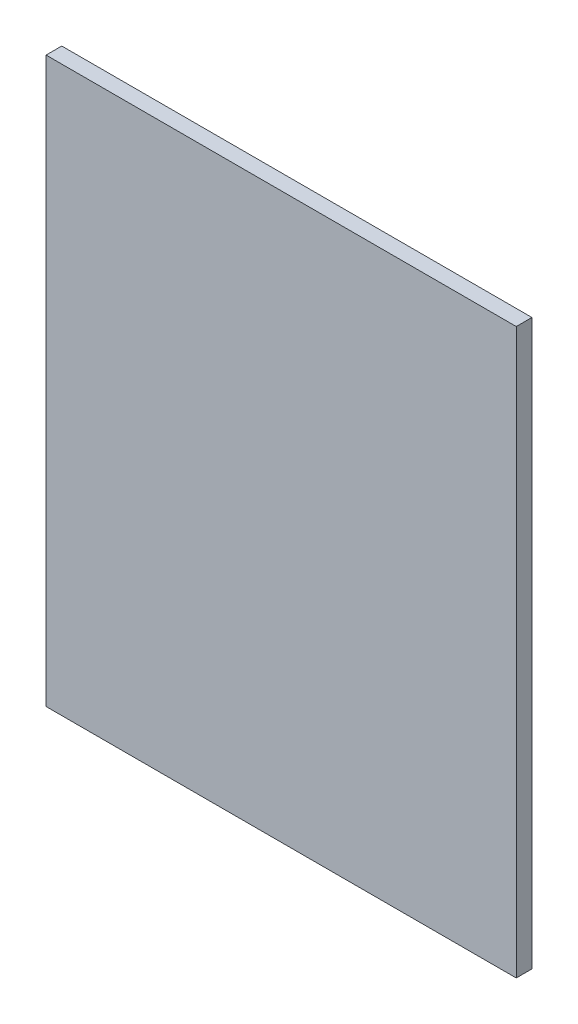
ISO-10303-21;
HEADER;
FILE_DESCRIPTION(('STEP AP214'),'2;1');
FILE_NAME('part.step','',(''),(''),'','','');
FILE_SCHEMA(('AUTOMOTIVE_DESIGN { 1 0 10303 214 1 1 1 1 }'));
ENDSEC;
DATA;
#1=APPLICATION_CONTEXT('core data for automotive mechanical design processes');
#2=APPLICATION_PROTOCOL_DEFINITION('international standard','automotive_design',2000,#1);
#3=PRODUCT_CONTEXT('',#1,'mechanical');
#4=PRODUCT('Part','Part','',(#3));
#5=PRODUCT_RELATED_PRODUCT_CATEGORY('part','',(#4));
#6=PRODUCT_DEFINITION_FORMATION('','',#4);
#7=PRODUCT_DEFINITION_CONTEXT('part definition',#1,'design');
#8=PRODUCT_DEFINITION('design','',#6,#7);
#9=PRODUCT_DEFINITION_SHAPE('','',#8);
#10=(LENGTH_UNIT() NAMED_UNIT(*) SI_UNIT(.MILLI.,.METRE.));
#11=(NAMED_UNIT(*) PLANE_ANGLE_UNIT() SI_UNIT($,.RADIAN.));
#12=(NAMED_UNIT(*) SI_UNIT($,.STERADIAN.) SOLID_ANGLE_UNIT());
#13=UNCERTAINTY_MEASURE_WITH_UNIT(LENGTH_MEASURE(1.E-05),#10,'distance_accuracy_value','');
#14=(GEOMETRIC_REPRESENTATION_CONTEXT(3) GLOBAL_UNCERTAINTY_ASSIGNED_CONTEXT((#13)) GLOBAL_UNIT_ASSIGNED_CONTEXT((#10,
#11,#12)) REPRESENTATION_CONTEXT('',''));
#15=CARTESIAN_POINT('',(0.,0.,0.));
#16=DIRECTION('',(0.,0.,1.));
#17=DIRECTION('',(1.,0.,0.));
#18=AXIS2_PLACEMENT_3D('',#15,#16,#17);
#19=CARTESIAN_POINT('',(0.,0.,6.35));
#20=DIRECTION('',(1.,0.,0.));
#21=DIRECTION('',(0.,1.,0.));
#22=AXIS2_PLACEMENT_3D('',#19,#20,#21);
#23=PLANE('',#22);
#24=DIRECTION('',(0.,-1.,0.));
#25=VECTOR('',#24,1.);
#26=CARTESIAN_POINT('',(0.,0.,0.));
#27=LINE('',#26,#25);
#28=CARTESIAN_POINT('',(0.,228.6,0.));
#29=VERTEX_POINT('',#28);
#30=CARTESIAN_POINT('',(0.,0.,0.));
#31=VERTEX_POINT('',#30);
#32=EDGE_CURVE('E97',#29,#31,#27,.T.);
#33=ORIENTED_EDGE('',*,*,#32,.T.);
#34=DIRECTION('',(0.,0.,-1.));
#35=VECTOR('',#34,1.);
#36=CARTESIAN_POINT('',(0.,0.,6.35));
#37=LINE('',#36,#35);
#38=CARTESIAN_POINT('',(0.,0.,6.35));
#39=VERTEX_POINT('',#38);
#40=EDGE_CURVE('E11',#39,#31,#37,.T.);
#41=ORIENTED_EDGE('',*,*,#40,.F.);
#42=DIRECTION('',(0.,-1.,0.));
#43=VECTOR('',#42,1.);
#44=CARTESIAN_POINT('',(0.,0.,6.35));
#45=LINE('',#44,#43);
#46=CARTESIAN_POINT('',(0.,228.6,6.35));
#47=VERTEX_POINT('',#46);
#48=EDGE_CURVE('E85',#47,#39,#45,.T.);
#49=ORIENTED_EDGE('',*,*,#48,.F.);
#50=DIRECTION('',(0.,0.,-1.));
#51=VECTOR('',#50,1.);
#52=CARTESIAN_POINT('',(0.,228.6,6.35));
#53=LINE('',#52,#51);
#54=EDGE_CURVE('E93',#47,#29,#53,.T.);
#55=ORIENTED_EDGE('',*,*,#54,.T.);
#56=EDGE_LOOP('',(#33,#41,#49,#55));
#57=FACE_BOUND('',#56,.T.);
#58=ADVANCED_FACE('F34',(#57),#23,.F.);
#59=CARTESIAN_POINT('',(0.,0.,6.35));
#60=DIRECTION('',(0.,1.,0.));
#61=DIRECTION('',(0.,0.,1.));
#62=AXIS2_PLACEMENT_3D('',#59,#60,#61);
#63=PLANE('',#62);
#64=DIRECTION('',(1.,0.,0.));
#65=VECTOR('',#64,1.);
#66=CARTESIAN_POINT('',(0.,0.,0.));
#67=LINE('',#66,#65);
#68=CARTESIAN_POINT('',(190.5,0.,0.));
#69=VERTEX_POINT('',#68);
#70=EDGE_CURVE('E89',#31,#69,#67,.T.);
#71=ORIENTED_EDGE('',*,*,#70,.T.);
#72=DIRECTION('',(0.,0.,-1.));
#73=VECTOR('',#72,1.);
#74=CARTESIAN_POINT('',(190.5,0.,6.35));
#75=LINE('',#74,#73);
#76=CARTESIAN_POINT('',(190.5,0.,6.35));
#77=VERTEX_POINT('',#76);
#78=EDGE_CURVE('E42',#77,#69,#75,.T.);
#79=ORIENTED_EDGE('',*,*,#78,.F.);
#80=DIRECTION('',(1.,0.,0.));
#81=VECTOR('',#80,1.);
#82=CARTESIAN_POINT('',(0.,0.,6.35));
#83=LINE('',#82,#81);
#84=EDGE_CURVE('E80',#39,#77,#83,.T.);
#85=ORIENTED_EDGE('',*,*,#84,.F.);
#86=ORIENTED_EDGE('',*,*,#40,.T.);
#87=EDGE_LOOP('',(#71,#79,#85,#86));
#88=FACE_BOUND('',#87,.T.);
#89=ADVANCED_FACE('F88',(#88),#63,.F.);
#90=CARTESIAN_POINT('',(190.5,0.,6.35));
#91=DIRECTION('',(-1.,0.,0.));
#92=DIRECTION('',(0.,-1.,0.));
#93=AXIS2_PLACEMENT_3D('',#90,#91,#92);
#94=PLANE('',#93);
#95=DIRECTION('',(0.,1.,0.));
#96=VECTOR('',#95,1.);
#97=CARTESIAN_POINT('',(190.5,0.,0.));
#98=LINE('',#97,#96);
#99=CARTESIAN_POINT('',(190.5,228.6,0.));
#100=VERTEX_POINT('',#99);
#101=EDGE_CURVE('E67',#69,#100,#98,.T.);
#102=ORIENTED_EDGE('',*,*,#101,.T.);
#103=DIRECTION('',(0.,0.,-1.));
#104=VECTOR('',#103,1.);
#105=CARTESIAN_POINT('',(190.5,228.6,6.35));
#106=LINE('',#105,#104);
#107=CARTESIAN_POINT('',(190.5,228.6,6.35));
#108=VERTEX_POINT('',#107);
#109=EDGE_CURVE('E90',#108,#100,#106,.T.);
#110=ORIENTED_EDGE('',*,*,#109,.F.);
#111=DIRECTION('',(0.,1.,0.));
#112=VECTOR('',#111,1.);
#113=CARTESIAN_POINT('',(190.5,0.,6.35));
#114=LINE('',#113,#112);
#115=EDGE_CURVE('E83',#77,#108,#114,.T.);
#116=ORIENTED_EDGE('',*,*,#115,.F.);
#117=ORIENTED_EDGE('',*,*,#78,.T.);
#118=EDGE_LOOP('',(#102,#110,#116,#117));
#119=FACE_BOUND('',#118,.T.);
#120=ADVANCED_FACE('F91',(#119),#94,.F.);
#121=CARTESIAN_POINT('',(0.,228.6,6.35));
#122=DIRECTION('',(0.,-1.,0.));
#123=DIRECTION('',(0.,0.,-1.));
#124=AXIS2_PLACEMENT_3D('',#121,#122,#123);
#125=PLANE('',#124);
#126=DIRECTION('',(-1.,0.,0.));
#127=VECTOR('',#126,1.);
#128=CARTESIAN_POINT('',(0.,228.6,0.));
#129=LINE('',#128,#127);
#130=EDGE_CURVE('E73',#100,#29,#129,.T.);
#131=ORIENTED_EDGE('',*,*,#130,.T.);
#132=ORIENTED_EDGE('',*,*,#54,.F.);
#133=DIRECTION('',(-1.,0.,0.));
#134=VECTOR('',#133,1.);
#135=CARTESIAN_POINT('',(0.,228.6,6.35));
#136=LINE('',#135,#134);
#137=EDGE_CURVE('E50',#108,#47,#136,.T.);
#138=ORIENTED_EDGE('',*,*,#137,.F.);
#139=ORIENTED_EDGE('',*,*,#109,.T.);
#140=EDGE_LOOP('',(#131,#132,#138,#139));
#141=FACE_BOUND('',#140,.T.);
#142=ADVANCED_FACE('F104',(#141),#125,.F.);
#143=CARTESIAN_POINT('',(0.,0.,6.35));
#144=DIRECTION('',(0.,0.,-1.));
#145=DIRECTION('',(-1.,0.,0.));
#146=AXIS2_PLACEMENT_3D('',#143,#144,#145);
#147=PLANE('',#146);
#148=ORIENTED_EDGE('',*,*,#48,.T.);
#149=ORIENTED_EDGE('',*,*,#84,.T.);
#150=ORIENTED_EDGE('',*,*,#115,.T.);
#151=ORIENTED_EDGE('',*,*,#137,.T.);
#152=EDGE_LOOP('',(#148,#149,#150,#151));
#153=FACE_BOUND('',#152,.T.);
#154=ADVANCED_FACE('F81',(#153),#147,.F.);
#155=CARTESIAN_POINT('',(0.,0.,0.));
#156=DIRECTION('',(0.,0.,-1.));
#157=DIRECTION('',(-1.,0.,0.));
#158=AXIS2_PLACEMENT_3D('',#155,#156,#157);
#159=PLANE('',#158);
#160=ORIENTED_EDGE('',*,*,#32,.F.);
#161=ORIENTED_EDGE('',*,*,#130,.F.);
#162=ORIENTED_EDGE('',*,*,#101,.F.);
#163=ORIENTED_EDGE('',*,*,#70,.F.);
#164=EDGE_LOOP('',(#160,#161,#162,#163));
#165=FACE_BOUND('',#164,.T.);
#166=ADVANCED_FACE('F107',(#165),#159,.T.);
#167=CLOSED_SHELL('',(#58,#89,#120,#142,#154,#166));
#168=MANIFOLD_SOLID_BREP('B2',#167);
#169=ADVANCED_BREP_SHAPE_REPRESENTATION('',(#18,#168),#14);
#170=SHAPE_DEFINITION_REPRESENTATION(#9,#169);
ENDSEC;
END-ISO-10303-21;
